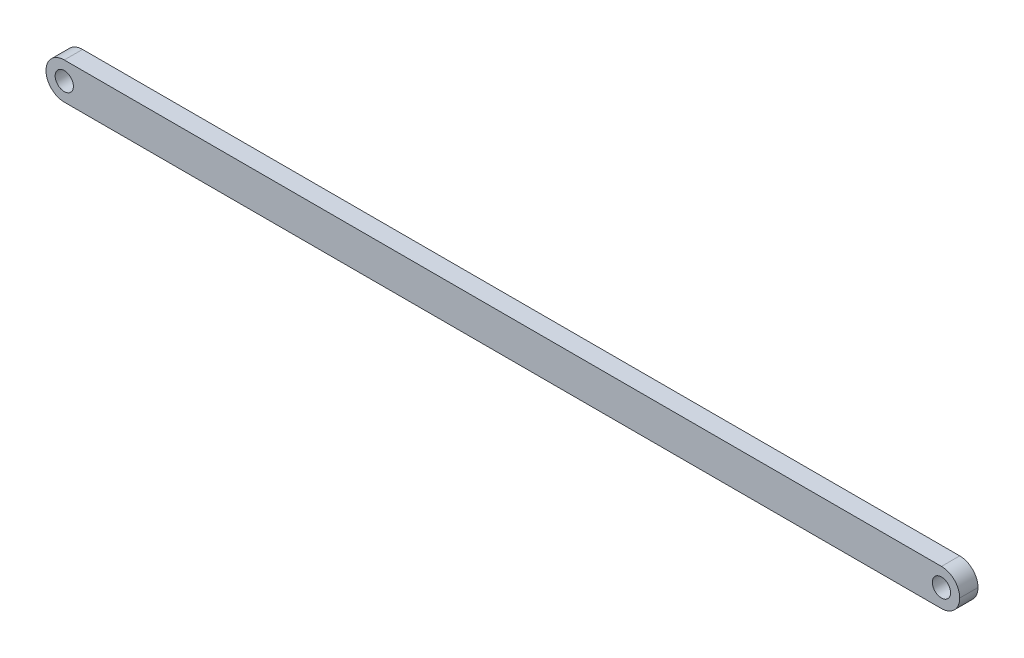
ISO-10303-21;
HEADER;
FILE_DESCRIPTION(('STEP AP214'),'2;1');
FILE_NAME('part.step','',(''),(''),'','','');
FILE_SCHEMA(('AUTOMOTIVE_DESIGN { 1 0 10303 214 1 1 1 1 }'));
ENDSEC;
DATA;
#1=APPLICATION_CONTEXT('core data for automotive mechanical design processes');
#2=APPLICATION_PROTOCOL_DEFINITION('international standard','automotive_design',2000,#1);
#3=PRODUCT_CONTEXT('',#1,'mechanical');
#4=PRODUCT('Part','Part','',(#3));
#5=PRODUCT_RELATED_PRODUCT_CATEGORY('part','',(#4));
#6=PRODUCT_DEFINITION_FORMATION('','',#4);
#7=PRODUCT_DEFINITION_CONTEXT('part definition',#1,'design');
#8=PRODUCT_DEFINITION('design','',#6,#7);
#9=PRODUCT_DEFINITION_SHAPE('','',#8);
#10=(LENGTH_UNIT() NAMED_UNIT(*) SI_UNIT(.MILLI.,.METRE.));
#11=(NAMED_UNIT(*) PLANE_ANGLE_UNIT() SI_UNIT($,.RADIAN.));
#12=(NAMED_UNIT(*) SI_UNIT($,.STERADIAN.) SOLID_ANGLE_UNIT());
#13=UNCERTAINTY_MEASURE_WITH_UNIT(LENGTH_MEASURE(1.E-05),#10,'distance_accuracy_value','');
#14=(GEOMETRIC_REPRESENTATION_CONTEXT(3) GLOBAL_UNCERTAINTY_ASSIGNED_CONTEXT((#13)) GLOBAL_UNIT_ASSIGNED_CONTEXT((#10,
#11,#12)) REPRESENTATION_CONTEXT('',''));
#15=CARTESIAN_POINT('',(0.,0.,0.));
#16=DIRECTION('',(0.,0.,1.));
#17=DIRECTION('',(1.,0.,0.));
#18=AXIS2_PLACEMENT_3D('',#15,#16,#17);
#19=CARTESIAN_POINT('',(0.,0.,10.));
#20=DIRECTION('',(0.,0.,1.));
#21=DIRECTION('',(1.,0.,0.));
#22=AXIS2_PLACEMENT_3D('',#19,#20,#21);
#23=PLANE('',#22);
#24=CARTESIAN_POINT('',(-240.,0.,10.));
#25=DIRECTION('',(0.,0.,1.));
#26=DIRECTION('',(1.,0.,0.));
#27=AXIS2_PLACEMENT_3D('',#24,#25,#26);
#28=CIRCLE('',#27,4.99999999999999);
#29=CARTESIAN_POINT('',(-235.,0.,10.));
#30=VERTEX_POINT('',#29);
#31=EDGE_CURVE('E138',#30,#30,#28,.T.);
#32=ORIENTED_EDGE('',*,*,#31,.F.);
#33=EDGE_LOOP('',(#32));
#34=FACE_BOUND('',#33,.T.);
#35=DIRECTION('',(1.,0.,0.));
#36=VECTOR('',#35,1.);
#37=CARTESIAN_POINT('',(-250.,-10.,10.));
#38=LINE('',#37,#36);
#39=CARTESIAN_POINT('',(-240.,-10.,10.));
#40=VERTEX_POINT('',#39);
#41=CARTESIAN_POINT('',(240.,-10.,10.));
#42=VERTEX_POINT('',#41);
#43=EDGE_CURVE('E130',#40,#42,#38,.T.);
#44=ORIENTED_EDGE('',*,*,#43,.T.);
#45=CARTESIAN_POINT('',(240.,0.,10.));
#46=DIRECTION('',(0.,0.,1.));
#47=DIRECTION('',(1.,0.,0.));
#48=AXIS2_PLACEMENT_3D('',#45,#46,#47);
#49=CIRCLE('',#48,10.);
#50=CARTESIAN_POINT('',(250.,0.,10.));
#51=VERTEX_POINT('',#50);
#52=EDGE_CURVE('E125',#42,#51,#49,.T.);
#53=ORIENTED_EDGE('',*,*,#52,.T.);
#54=CARTESIAN_POINT('',(240.,0.,10.));
#55=DIRECTION('',(0.,0.,1.));
#56=DIRECTION('',(1.,0.,0.));
#57=AXIS2_PLACEMENT_3D('',#54,#55,#56);
#58=CIRCLE('',#57,10.);
#59=CARTESIAN_POINT('',(240.,10.,10.));
#60=VERTEX_POINT('',#59);
#61=EDGE_CURVE('E107',#51,#60,#58,.T.);
#62=ORIENTED_EDGE('',*,*,#61,.T.);
#63=DIRECTION('',(-1.,0.,0.));
#64=VECTOR('',#63,1.);
#65=CARTESIAN_POINT('',(-250.,10.,10.));
#66=LINE('',#65,#64);
#67=CARTESIAN_POINT('',(-240.,10.,10.));
#68=VERTEX_POINT('',#67);
#69=EDGE_CURVE('E135',#60,#68,#66,.T.);
#70=ORIENTED_EDGE('',*,*,#69,.T.);
#71=CARTESIAN_POINT('',(-240.,0.,10.));
#72=DIRECTION('',(0.,0.,1.));
#73=DIRECTION('',(1.,0.,0.));
#74=AXIS2_PLACEMENT_3D('',#71,#72,#73);
#75=CIRCLE('',#74,10.);
#76=CARTESIAN_POINT('',(-250.,0.,10.));
#77=VERTEX_POINT('',#76);
#78=EDGE_CURVE('E52',#68,#77,#75,.T.);
#79=ORIENTED_EDGE('',*,*,#78,.T.);
#80=CARTESIAN_POINT('',(-240.,0.,10.));
#81=DIRECTION('',(0.,0.,1.));
#82=DIRECTION('',(1.,0.,0.));
#83=AXIS2_PLACEMENT_3D('',#80,#81,#82);
#84=CIRCLE('',#83,10.);
#85=EDGE_CURVE('E122',#77,#40,#84,.T.);
#86=ORIENTED_EDGE('',*,*,#85,.T.);
#87=EDGE_LOOP('',(#44,#53,#62,#70,#79,#86));
#88=FACE_BOUND('',#87,.T.);
#89=CARTESIAN_POINT('',(240.,0.,10.));
#90=DIRECTION('',(0.,0.,1.));
#91=DIRECTION('',(1.,0.,0.));
#92=AXIS2_PLACEMENT_3D('',#89,#90,#91);
#93=CIRCLE('',#92,4.99999999999999);
#94=CARTESIAN_POINT('',(245.,0.,10.));
#95=VERTEX_POINT('',#94);
#96=EDGE_CURVE('E186',#95,#95,#93,.T.);
#97=ORIENTED_EDGE('',*,*,#96,.F.);
#98=EDGE_LOOP('',(#97));
#99=FACE_BOUND('',#98,.T.);
#100=ADVANCED_FACE('F35',(#34,#88,#99),#23,.T.);
#101=CARTESIAN_POINT('',(0.,0.,0.));
#102=DIRECTION('',(0.,0.,1.));
#103=DIRECTION('',(1.,0.,0.));
#104=AXIS2_PLACEMENT_3D('',#101,#102,#103);
#105=PLANE('',#104);
#106=CARTESIAN_POINT('',(-240.,0.,0.));
#107=DIRECTION('',(0.,0.,1.));
#108=DIRECTION('',(1.,0.,0.));
#109=AXIS2_PLACEMENT_3D('',#106,#107,#108);
#110=CIRCLE('',#109,4.99999999999999);
#111=CARTESIAN_POINT('',(-235.,0.,0.));
#112=VERTEX_POINT('',#111);
#113=EDGE_CURVE('E190',#112,#112,#110,.T.);
#114=ORIENTED_EDGE('',*,*,#113,.T.);
#115=EDGE_LOOP('',(#114));
#116=FACE_BOUND('',#115,.T.);
#117=CARTESIAN_POINT('',(240.,0.,0.));
#118=DIRECTION('',(0.,0.,1.));
#119=DIRECTION('',(1.,0.,0.));
#120=AXIS2_PLACEMENT_3D('',#117,#118,#119);
#121=CIRCLE('',#120,10.);
#122=CARTESIAN_POINT('',(240.,10.,0.));
#123=VERTEX_POINT('',#122);
#124=CARTESIAN_POINT('',(250.,0.,0.));
#125=VERTEX_POINT('',#124);
#126=EDGE_CURVE('E90',#123,#125,#121,.F.);
#127=ORIENTED_EDGE('',*,*,#126,.T.);
#128=CARTESIAN_POINT('',(240.,0.,0.));
#129=DIRECTION('',(0.,0.,1.));
#130=DIRECTION('',(1.,0.,0.));
#131=AXIS2_PLACEMENT_3D('',#128,#129,#130);
#132=CIRCLE('',#131,10.);
#133=CARTESIAN_POINT('',(240.,-10.,0.));
#134=VERTEX_POINT('',#133);
#135=EDGE_CURVE('E96',#125,#134,#132,.F.);
#136=ORIENTED_EDGE('',*,*,#135,.T.);
#137=DIRECTION('',(1.,0.,0.));
#138=VECTOR('',#137,1.);
#139=CARTESIAN_POINT('',(-250.,-10.,0.));
#140=LINE('',#139,#138);
#141=CARTESIAN_POINT('',(-240.,-10.,0.));
#142=VERTEX_POINT('',#141);
#143=EDGE_CURVE('E134',#142,#134,#140,.T.);
#144=ORIENTED_EDGE('',*,*,#143,.F.);
#145=CARTESIAN_POINT('',(-240.,0.,0.));
#146=DIRECTION('',(0.,0.,1.));
#147=DIRECTION('',(1.,0.,0.));
#148=AXIS2_PLACEMENT_3D('',#145,#146,#147);
#149=CIRCLE('',#148,10.);
#150=CARTESIAN_POINT('',(-250.,0.,0.));
#151=VERTEX_POINT('',#150);
#152=EDGE_CURVE('E101',#142,#151,#149,.F.);
#153=ORIENTED_EDGE('',*,*,#152,.T.);
#154=CARTESIAN_POINT('',(-240.,0.,0.));
#155=DIRECTION('',(0.,0.,1.));
#156=DIRECTION('',(1.,0.,0.));
#157=AXIS2_PLACEMENT_3D('',#154,#155,#156);
#158=CIRCLE('',#157,10.);
#159=CARTESIAN_POINT('',(-240.,10.,0.));
#160=VERTEX_POINT('',#159);
#161=EDGE_CURVE('E142',#151,#160,#158,.F.);
#162=ORIENTED_EDGE('',*,*,#161,.T.);
#163=DIRECTION('',(-1.,0.,0.));
#164=VECTOR('',#163,1.);
#165=CARTESIAN_POINT('',(-250.,10.,0.));
#166=LINE('',#165,#164);
#167=EDGE_CURVE('E98',#123,#160,#166,.T.);
#168=ORIENTED_EDGE('',*,*,#167,.F.);
#169=EDGE_LOOP('',(#127,#136,#144,#153,#162,#168));
#170=FACE_BOUND('',#169,.T.);
#171=CARTESIAN_POINT('',(240.,0.,0.));
#172=DIRECTION('',(0.,0.,1.));
#173=DIRECTION('',(1.,0.,0.));
#174=AXIS2_PLACEMENT_3D('',#171,#172,#173);
#175=CIRCLE('',#174,4.99999999999999);
#176=CARTESIAN_POINT('',(245.,0.,0.));
#177=VERTEX_POINT('',#176);
#178=EDGE_CURVE('E109',#177,#177,#175,.T.);
#179=ORIENTED_EDGE('',*,*,#178,.T.);
#180=EDGE_LOOP('',(#179));
#181=FACE_BOUND('',#180,.T.);
#182=ADVANCED_FACE('F92',(#116,#170,#181),#105,.F.);
#183=CARTESIAN_POINT('',(-250.,10.,10.));
#184=DIRECTION('',(0.,-1.,0.));
#185=DIRECTION('',(0.,0.,-1.));
#186=AXIS2_PLACEMENT_3D('',#183,#184,#185);
#187=PLANE('',#186);
#188=ORIENTED_EDGE('',*,*,#69,.F.);
#189=DIRECTION('',(0.,0.,-1.));
#190=VECTOR('',#189,1.);
#191=CARTESIAN_POINT('',(240.,10.,10.));
#192=LINE('',#191,#190);
#193=EDGE_CURVE('E11',#60,#123,#192,.T.);
#194=ORIENTED_EDGE('',*,*,#193,.T.);
#195=ORIENTED_EDGE('',*,*,#167,.T.);
#196=DIRECTION('',(0.,0.,-1.));
#197=VECTOR('',#196,1.);
#198=CARTESIAN_POINT('',(-240.,10.,10.));
#199=LINE('',#198,#197);
#200=EDGE_CURVE('E44',#160,#68,#199,.F.);
#201=ORIENTED_EDGE('',*,*,#200,.T.);
#202=EDGE_LOOP('',(#188,#194,#195,#201));
#203=FACE_BOUND('',#202,.T.);
#204=ADVANCED_FACE('F160',(#203),#187,.F.);
#205=CARTESIAN_POINT('',(-250.,-10.,10.));
#206=DIRECTION('',(0.,1.,0.));
#207=DIRECTION('',(0.,0.,1.));
#208=AXIS2_PLACEMENT_3D('',#205,#206,#207);
#209=PLANE('',#208);
#210=ORIENTED_EDGE('',*,*,#143,.T.);
#211=DIRECTION('',(0.,0.,-1.));
#212=VECTOR('',#211,1.);
#213=CARTESIAN_POINT('',(240.,-10.,10.));
#214=LINE('',#213,#212);
#215=EDGE_CURVE('E113',#134,#42,#214,.F.);
#216=ORIENTED_EDGE('',*,*,#215,.T.);
#217=ORIENTED_EDGE('',*,*,#43,.F.);
#218=DIRECTION('',(0.,0.,-1.));
#219=VECTOR('',#218,1.);
#220=CARTESIAN_POINT('',(-240.,-10.,10.));
#221=LINE('',#220,#219);
#222=EDGE_CURVE('E114',#40,#142,#221,.T.);
#223=ORIENTED_EDGE('',*,*,#222,.T.);
#224=EDGE_LOOP('',(#210,#216,#217,#223));
#225=FACE_BOUND('',#224,.T.);
#226=ADVANCED_FACE('F132',(#225),#209,.F.);
#227=CARTESIAN_POINT('',(-240.,0.,10.));
#228=DIRECTION('',(0.,0.,-1.));
#229=DIRECTION('',(-1.,0.,0.));
#230=AXIS2_PLACEMENT_3D('',#227,#228,#229);
#231=CYLINDRICAL_SURFACE('',#230,4.99999999999999);
#232=ORIENTED_EDGE('',*,*,#31,.T.);
#233=EDGE_LOOP('',(#232));
#234=FACE_BOUND('',#233,.T.);
#235=ORIENTED_EDGE('',*,*,#113,.F.);
#236=EDGE_LOOP('',(#235));
#237=FACE_BOUND('',#236,.T.);
#238=ADVANCED_FACE('F165',(#234,#237),#231,.F.);
#239=CARTESIAN_POINT('',(240.,0.,10.));
#240=DIRECTION('',(0.,0.,-1.));
#241=DIRECTION('',(-1.,0.,0.));
#242=AXIS2_PLACEMENT_3D('',#239,#240,#241);
#243=CYLINDRICAL_SURFACE('',#242,4.99999999999999);
#244=ORIENTED_EDGE('',*,*,#96,.T.);
#245=EDGE_LOOP('',(#244));
#246=FACE_BOUND('',#245,.T.);
#247=ORIENTED_EDGE('',*,*,#178,.F.);
#248=EDGE_LOOP('',(#247));
#249=FACE_BOUND('',#248,.T.);
#250=ADVANCED_FACE('F174',(#246,#249),#243,.F.);
#251=CARTESIAN_POINT('',(240.,0.,10.));
#252=DIRECTION('',(0.,0.,-1.));
#253=DIRECTION('',(-1.,0.,0.));
#254=AXIS2_PLACEMENT_3D('',#251,#252,#253);
#255=CYLINDRICAL_SURFACE('',#254,10.);
#256=ORIENTED_EDGE('',*,*,#193,.F.);
#257=ORIENTED_EDGE('',*,*,#61,.F.);
#258=DIRECTION('',(0.,0.,-1.));
#259=VECTOR('',#258,1.);
#260=CARTESIAN_POINT('',(250.,0.,10.));
#261=LINE('',#260,#259);
#262=EDGE_CURVE('E105',#125,#51,#261,.F.);
#263=ORIENTED_EDGE('',*,*,#262,.F.);
#264=ORIENTED_EDGE('',*,*,#126,.F.);
#265=EDGE_LOOP('',(#256,#257,#263,#264));
#266=FACE_BOUND('',#265,.T.);
#267=ADVANCED_FACE('F106',(#266),#255,.T.);
#268=CARTESIAN_POINT('',(240.,0.,10.));
#269=DIRECTION('',(0.,0.,-1.));
#270=DIRECTION('',(-1.,0.,0.));
#271=AXIS2_PLACEMENT_3D('',#268,#269,#270);
#272=CYLINDRICAL_SURFACE('',#271,10.);
#273=ORIENTED_EDGE('',*,*,#52,.F.);
#274=ORIENTED_EDGE('',*,*,#215,.F.);
#275=ORIENTED_EDGE('',*,*,#135,.F.);
#276=ORIENTED_EDGE('',*,*,#262,.T.);
#277=EDGE_LOOP('',(#273,#274,#275,#276));
#278=FACE_BOUND('',#277,.T.);
#279=ADVANCED_FACE('F111',(#278),#272,.T.);
#280=CARTESIAN_POINT('',(-240.,0.,10.));
#281=DIRECTION('',(0.,0.,-1.));
#282=DIRECTION('',(-1.,0.,0.));
#283=AXIS2_PLACEMENT_3D('',#280,#281,#282);
#284=CYLINDRICAL_SURFACE('',#283,10.);
#285=DIRECTION('',(0.,0.,-1.));
#286=VECTOR('',#285,1.);
#287=CARTESIAN_POINT('',(-250.,0.,10.));
#288=LINE('',#287,#286);
#289=EDGE_CURVE('E39',#77,#151,#288,.T.);
#290=ORIENTED_EDGE('',*,*,#289,.F.);
#291=ORIENTED_EDGE('',*,*,#78,.F.);
#292=ORIENTED_EDGE('',*,*,#200,.F.);
#293=ORIENTED_EDGE('',*,*,#161,.F.);
#294=EDGE_LOOP('',(#290,#291,#292,#293));
#295=FACE_BOUND('',#294,.T.);
#296=ADVANCED_FACE('F37',(#295),#284,.T.);
#297=CARTESIAN_POINT('',(-240.,0.,10.));
#298=DIRECTION('',(0.,0.,-1.));
#299=DIRECTION('',(-1.,0.,0.));
#300=AXIS2_PLACEMENT_3D('',#297,#298,#299);
#301=CYLINDRICAL_SURFACE('',#300,10.);
#302=ORIENTED_EDGE('',*,*,#85,.F.);
#303=ORIENTED_EDGE('',*,*,#289,.T.);
#304=ORIENTED_EDGE('',*,*,#152,.F.);
#305=ORIENTED_EDGE('',*,*,#222,.F.);
#306=EDGE_LOOP('',(#302,#303,#304,#305));
#307=FACE_BOUND('',#306,.T.);
#308=ADVANCED_FACE('F148',(#307),#301,.T.);
#309=CLOSED_SHELL('',(#100,#182,#204,#226,#238,#250,#267,#279,#296,#308));
#310=MANIFOLD_SOLID_BREP('B2',#309);
#311=ADVANCED_BREP_SHAPE_REPRESENTATION('',(#18,#310),#14);
#312=SHAPE_DEFINITION_REPRESENTATION(#9,#311);
ENDSEC;
END-ISO-10303-21;
